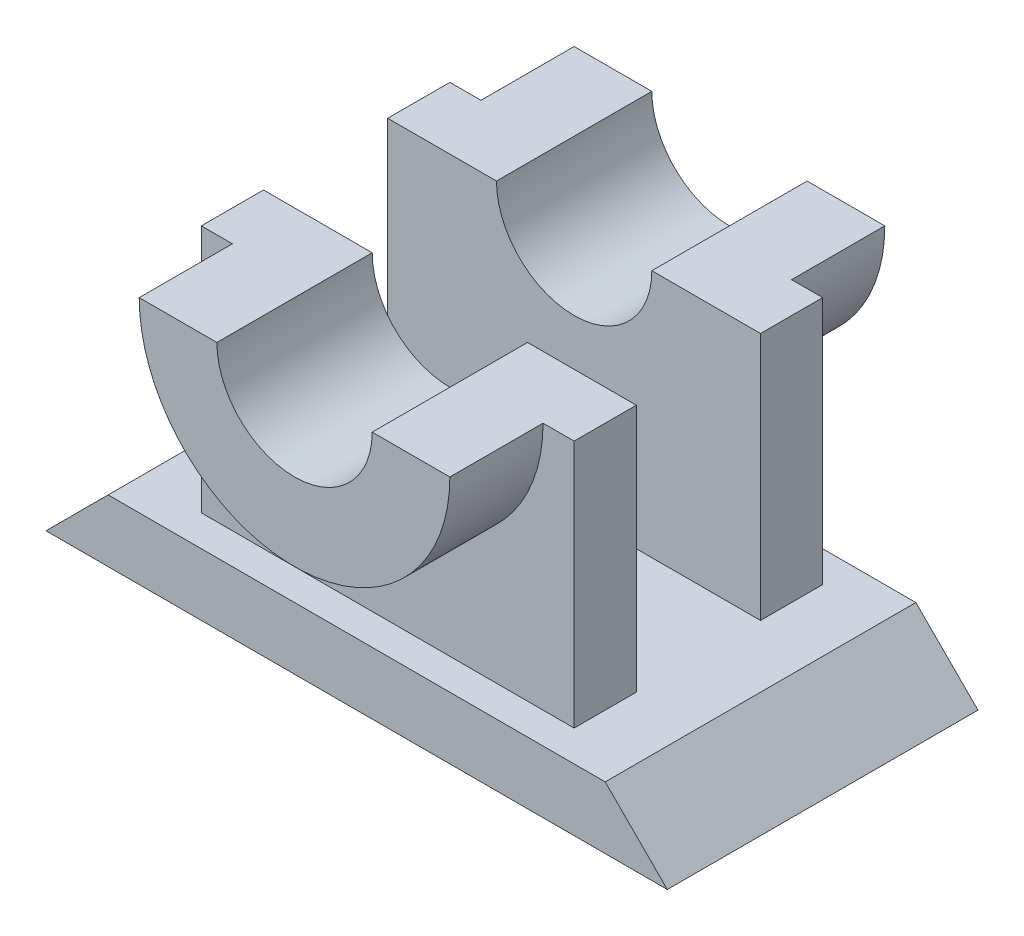
ISO-10303-21;
HEADER;
FILE_DESCRIPTION(('STEP AP214'),'2;1');
FILE_NAME('part.step','',(''),(''),'','','');
FILE_SCHEMA(('AUTOMOTIVE_DESIGN { 1 0 10303 214 1 1 1 1 }'));
ENDSEC;
DATA;
#1=APPLICATION_CONTEXT('core data for automotive mechanical design processes');
#2=APPLICATION_PROTOCOL_DEFINITION('international standard','automotive_design',2000,#1);
#3=PRODUCT_CONTEXT('',#1,'mechanical');
#4=PRODUCT('Part','Part','',(#3));
#5=PRODUCT_RELATED_PRODUCT_CATEGORY('part','',(#4));
#6=PRODUCT_DEFINITION_FORMATION('','',#4);
#7=PRODUCT_DEFINITION_CONTEXT('part definition',#1,'design');
#8=PRODUCT_DEFINITION('design','',#6,#7);
#9=PRODUCT_DEFINITION_SHAPE('','',#8);
#10=(LENGTH_UNIT() NAMED_UNIT(*) SI_UNIT(.MILLI.,.METRE.));
#11=(NAMED_UNIT(*) PLANE_ANGLE_UNIT() SI_UNIT($,.RADIAN.));
#12=(NAMED_UNIT(*) SI_UNIT($,.STERADIAN.) SOLID_ANGLE_UNIT());
#13=UNCERTAINTY_MEASURE_WITH_UNIT(LENGTH_MEASURE(1.E-05),#10,'distance_accuracy_value','');
#14=(GEOMETRIC_REPRESENTATION_CONTEXT(3) GLOBAL_UNCERTAINTY_ASSIGNED_CONTEXT((#13)) GLOBAL_UNIT_ASSIGNED_CONTEXT((#10,
#11,#12)) REPRESENTATION_CONTEXT('',''));
#15=CARTESIAN_POINT('',(0.,0.,0.));
#16=DIRECTION('',(0.,0.,1.));
#17=DIRECTION('',(1.,0.,0.));
#18=AXIS2_PLACEMENT_3D('',#15,#16,#17);
#19=CARTESIAN_POINT('',(0.,9.99999999999999,25.));
#20=DIRECTION('',(0.,-1.,0.));
#21=DIRECTION('',(1.,0.,0.));
#22=AXIS2_PLACEMENT_3D('',#19,#20,#21);
#23=PLANE('',#22);
#24=DIRECTION('',(-1.,0.,0.));
#25=VECTOR('',#24,1.);
#26=CARTESIAN_POINT('',(0.,9.99999999999999,-25.));
#27=LINE('',#26,#25);
#28=CARTESIAN_POINT('',(90.,9.99999999999999,-25.));
#29=VERTEX_POINT('',#28);
#30=CARTESIAN_POINT('',(10.,9.99999999999999,-25.));
#31=VERTEX_POINT('',#30);
#32=EDGE_CURVE('E308',#29,#31,#27,.T.);
#33=ORIENTED_EDGE('',*,*,#32,.T.);
#34=DIRECTION('',(0.,0.,-1.));
#35=VECTOR('',#34,1.);
#36=CARTESIAN_POINT('',(10.,9.99999999999999,25.));
#37=LINE('',#36,#35);
#38=CARTESIAN_POINT('',(10.,9.99999999999999,25.));
#39=VERTEX_POINT('',#38);
#40=EDGE_CURVE('E11',#39,#31,#37,.T.);
#41=ORIENTED_EDGE('',*,*,#40,.F.);
#42=DIRECTION('',(-1.,0.,0.));
#43=VECTOR('',#42,1.);
#44=CARTESIAN_POINT('',(0.,9.99999999999999,25.));
#45=LINE('',#44,#43);
#46=CARTESIAN_POINT('',(90.,9.99999999999999,25.));
#47=VERTEX_POINT('',#46);
#48=EDGE_CURVE('E309',#47,#39,#45,.T.);
#49=ORIENTED_EDGE('',*,*,#48,.F.);
#50=DIRECTION('',(0.,0.,-1.));
#51=VECTOR('',#50,1.);
#52=CARTESIAN_POINT('',(90.,9.99999999999999,25.));
#53=LINE('',#52,#51);
#54=EDGE_CURVE('E319',#47,#29,#53,.T.);
#55=ORIENTED_EDGE('',*,*,#54,.T.);
#56=EDGE_LOOP('',(#33,#41,#49,#55));
#57=FACE_BOUND('',#56,.T.);
#58=DIRECTION('',(0.,0.,-1.));
#59=VECTOR('',#58,1.);
#60=CARTESIAN_POINT('',(80.,10.,20.));
#61=LINE('',#60,#59);
#62=CARTESIAN_POINT('',(80.,10.,20.));
#63=VERTEX_POINT('',#62);
#64=CARTESIAN_POINT('',(80.,10.,10.));
#65=VERTEX_POINT('',#64);
#66=EDGE_CURVE('E301',#63,#65,#61,.T.);
#67=ORIENTED_EDGE('',*,*,#66,.F.);
#68=DIRECTION('',(-1.,0.,0.));
#69=VECTOR('',#68,1.);
#70=CARTESIAN_POINT('',(0.,9.99999999999999,20.));
#71=LINE('',#70,#69);
#72=CARTESIAN_POINT('',(20.,9.99999999999999,20.));
#73=VERTEX_POINT('',#72);
#74=EDGE_CURVE('E61',#63,#73,#71,.T.);
#75=ORIENTED_EDGE('',*,*,#74,.T.);
#76=DIRECTION('',(0.,0.,-1.));
#77=VECTOR('',#76,1.);
#78=CARTESIAN_POINT('',(20.,9.99999999999999,20.));
#79=LINE('',#78,#77);
#80=CARTESIAN_POINT('',(20.,9.99999999999999,10.));
#81=VERTEX_POINT('',#80);
#82=EDGE_CURVE('E304',#73,#81,#79,.T.);
#83=ORIENTED_EDGE('',*,*,#82,.T.);
#84=DIRECTION('',(-1.,0.,0.));
#85=VECTOR('',#84,1.);
#86=CARTESIAN_POINT('',(0.,9.99999999999999,10.));
#87=LINE('',#86,#85);
#88=EDGE_CURVE('E292',#65,#81,#87,.T.);
#89=ORIENTED_EDGE('',*,*,#88,.F.);
#90=EDGE_LOOP('',(#67,#75,#83,#89));
#91=FACE_BOUND('',#90,.T.);
#92=DIRECTION('',(-1.,0.,0.));
#93=VECTOR('',#92,1.);
#94=CARTESIAN_POINT('',(0.,9.99999999999999,-20.));
#95=LINE('',#94,#93);
#96=CARTESIAN_POINT('',(80.,10.,-20.));
#97=VERTEX_POINT('',#96);
#98=CARTESIAN_POINT('',(20.,9.99999999999999,-20.));
#99=VERTEX_POINT('',#98);
#100=EDGE_CURVE('E246',#97,#99,#95,.T.);
#101=ORIENTED_EDGE('',*,*,#100,.F.);
#102=DIRECTION('',(0.,0.,1.));
#103=VECTOR('',#102,1.);
#104=CARTESIAN_POINT('',(80.,10.,-20.));
#105=LINE('',#104,#103);
#106=CARTESIAN_POINT('',(80.,10.,-10.));
#107=VERTEX_POINT('',#106);
#108=EDGE_CURVE('E265',#97,#107,#105,.T.);
#109=ORIENTED_EDGE('',*,*,#108,.T.);
#110=DIRECTION('',(-1.,0.,0.));
#111=VECTOR('',#110,1.);
#112=CARTESIAN_POINT('',(0.,9.99999999999999,-10.));
#113=LINE('',#112,#111);
#114=CARTESIAN_POINT('',(20.,9.99999999999999,-10.));
#115=VERTEX_POINT('',#114);
#116=EDGE_CURVE('E255',#107,#115,#113,.T.);
#117=ORIENTED_EDGE('',*,*,#116,.T.);
#118=DIRECTION('',(0.,0.,1.));
#119=VECTOR('',#118,1.);
#120=CARTESIAN_POINT('',(20.,9.99999999999999,-20.));
#121=LINE('',#120,#119);
#122=EDGE_CURVE('E268',#99,#115,#121,.T.);
#123=ORIENTED_EDGE('',*,*,#122,.F.);
#124=EDGE_LOOP('',(#101,#109,#117,#123));
#125=FACE_BOUND('',#124,.T.);
#126=ADVANCED_FACE('F39',(#57,#91,#125),#23,.F.);
#127=CARTESIAN_POINT('',(0.,0.,25.));
#128=DIRECTION('',(0.707106781186547,-0.707106781186548,0.));
#129=DIRECTION('',(0.707106781186548,0.707106781186547,0.));
#130=AXIS2_PLACEMENT_3D('',#127,#128,#129);
#131=PLANE('',#130);
#132=DIRECTION('',(-0.707106781186548,-0.707106781186547,0.));
#133=VECTOR('',#132,1.);
#134=CARTESIAN_POINT('',(0.,0.,-25.));
#135=LINE('',#134,#133);
#136=CARTESIAN_POINT('',(0.,0.,-25.));
#137=VERTEX_POINT('',#136);
#138=EDGE_CURVE('E322',#31,#137,#135,.T.);
#139=ORIENTED_EDGE('',*,*,#138,.T.);
#140=DIRECTION('',(0.,0.,-1.));
#141=VECTOR('',#140,1.);
#142=CARTESIAN_POINT('',(0.,0.,25.));
#143=LINE('',#142,#141);
#144=CARTESIAN_POINT('',(0.,0.,25.));
#145=VERTEX_POINT('',#144);
#146=EDGE_CURVE('E46',#145,#137,#143,.T.);
#147=ORIENTED_EDGE('',*,*,#146,.F.);
#148=DIRECTION('',(-0.707106781186548,-0.707106781186547,0.));
#149=VECTOR('',#148,1.);
#150=CARTESIAN_POINT('',(0.,0.,25.));
#151=LINE('',#150,#149);
#152=EDGE_CURVE('E312',#39,#145,#151,.T.);
#153=ORIENTED_EDGE('',*,*,#152,.F.);
#154=ORIENTED_EDGE('',*,*,#40,.T.);
#155=EDGE_LOOP('',(#139,#147,#153,#154));
#156=FACE_BOUND('',#155,.T.);
#157=ADVANCED_FACE('F352',(#156),#131,.F.);
#158=CARTESIAN_POINT('',(0.,0.,25.));
#159=DIRECTION('',(0.,1.,0.));
#160=DIRECTION('',(0.,0.,1.));
#161=AXIS2_PLACEMENT_3D('',#158,#159,#160);
#162=PLANE('',#161);
#163=DIRECTION('',(1.,0.,0.));
#164=VECTOR('',#163,1.);
#165=CARTESIAN_POINT('',(0.,0.,-25.));
#166=LINE('',#165,#164);
#167=CARTESIAN_POINT('',(100.,0.,-25.));
#168=VERTEX_POINT('',#167);
#169=EDGE_CURVE('E324',#137,#168,#166,.T.);
#170=ORIENTED_EDGE('',*,*,#169,.T.);
#171=DIRECTION('',(0.,0.,-1.));
#172=VECTOR('',#171,1.);
#173=CARTESIAN_POINT('',(100.,0.,25.));
#174=LINE('',#173,#172);
#175=CARTESIAN_POINT('',(100.,0.,25.));
#176=VERTEX_POINT('',#175);
#177=EDGE_CURVE('E329',#176,#168,#174,.T.);
#178=ORIENTED_EDGE('',*,*,#177,.F.);
#179=DIRECTION('',(1.,0.,0.));
#180=VECTOR('',#179,1.);
#181=CARTESIAN_POINT('',(0.,0.,25.));
#182=LINE('',#181,#180);
#183=EDGE_CURVE('E315',#145,#176,#182,.T.);
#184=ORIENTED_EDGE('',*,*,#183,.F.);
#185=ORIENTED_EDGE('',*,*,#146,.T.);
#186=EDGE_LOOP('',(#170,#178,#184,#185));
#187=FACE_BOUND('',#186,.T.);
#188=ADVANCED_FACE('F336',(#187),#162,.F.);
#189=CARTESIAN_POINT('',(50.,50.,25.));
#190=DIRECTION('',(-0.707106781186548,-0.707106781186547,0.));
#191=DIRECTION('',(0.707106781186547,-0.707106781186548,0.));
#192=AXIS2_PLACEMENT_3D('',#189,#190,#191);
#193=PLANE('',#192);
#194=DIRECTION('',(-0.707106781186547,0.707106781186548,0.));
#195=VECTOR('',#194,1.);
#196=CARTESIAN_POINT('',(50.,50.,-25.));
#197=LINE('',#196,#195);
#198=EDGE_CURVE('E313',#168,#29,#197,.T.);
#199=ORIENTED_EDGE('',*,*,#198,.T.);
#200=ORIENTED_EDGE('',*,*,#54,.F.);
#201=DIRECTION('',(-0.707106781186547,0.707106781186548,0.));
#202=VECTOR('',#201,1.);
#203=CARTESIAN_POINT('',(50.,50.,25.));
#204=LINE('',#203,#202);
#205=EDGE_CURVE('E317',#176,#47,#204,.T.);
#206=ORIENTED_EDGE('',*,*,#205,.F.);
#207=ORIENTED_EDGE('',*,*,#177,.T.);
#208=EDGE_LOOP('',(#199,#200,#206,#207));
#209=FACE_BOUND('',#208,.T.);
#210=ADVANCED_FACE('F345',(#209),#193,.F.);
#211=CARTESIAN_POINT('',(0.,0.,25.));
#212=DIRECTION('',(0.,0.,1.));
#213=DIRECTION('',(1.,0.,0.));
#214=AXIS2_PLACEMENT_3D('',#211,#212,#213);
#215=PLANE('',#214);
#216=ORIENTED_EDGE('',*,*,#48,.T.);
#217=ORIENTED_EDGE('',*,*,#152,.T.);
#218=ORIENTED_EDGE('',*,*,#183,.T.);
#219=ORIENTED_EDGE('',*,*,#205,.T.);
#220=EDGE_LOOP('',(#216,#217,#218,#219));
#221=FACE_BOUND('',#220,.T.);
#222=ADVANCED_FACE('F351',(#221),#215,.T.);
#223=CARTESIAN_POINT('',(0.,0.,-25.));
#224=DIRECTION('',(0.,0.,1.));
#225=DIRECTION('',(1.,0.,0.));
#226=AXIS2_PLACEMENT_3D('',#223,#224,#225);
#227=PLANE('',#226);
#228=ORIENTED_EDGE('',*,*,#32,.F.);
#229=ORIENTED_EDGE('',*,*,#198,.F.);
#230=ORIENTED_EDGE('',*,*,#169,.F.);
#231=ORIENTED_EDGE('',*,*,#138,.F.);
#232=EDGE_LOOP('',(#228,#229,#230,#231));
#233=FACE_BOUND('',#232,.T.);
#234=ADVANCED_FACE('F342',(#233),#227,.F.);
#235=CARTESIAN_POINT('',(0.,50.,20.));
#236=DIRECTION('',(0.,1.,0.));
#237=DIRECTION('',(0.,0.,1.));
#238=AXIS2_PLACEMENT_3D('',#235,#236,#237);
#239=PLANE('',#238);
#240=DIRECTION('',(1.,0.,0.));
#241=VECTOR('',#240,1.);
#242=CARTESIAN_POINT('',(0.,50.,10.));
#243=LINE('',#242,#241);
#244=CARTESIAN_POINT('',(20.,50.,10.));
#245=VERTEX_POINT('',#244);
#246=CARTESIAN_POINT('',(37.5,50.,10.));
#247=VERTEX_POINT('',#246);
#248=EDGE_CURVE('E264',#245,#247,#243,.T.);
#249=ORIENTED_EDGE('',*,*,#248,.F.);
#250=DIRECTION('',(0.,0.,-1.));
#251=VECTOR('',#250,1.);
#252=CARTESIAN_POINT('',(20.,50.,20.));
#253=LINE('',#252,#251);
#254=CARTESIAN_POINT('',(20.,50.,20.));
#255=VERTEX_POINT('',#254);
#256=EDGE_CURVE('E306',#255,#245,#253,.T.);
#257=ORIENTED_EDGE('',*,*,#256,.F.);
#258=DIRECTION('',(1.,0.,0.));
#259=VECTOR('',#258,1.);
#260=CARTESIAN_POINT('',(0.,50.,20.));
#261=LINE('',#260,#259);
#262=CARTESIAN_POINT('',(25.,50.,20.));
#263=VERTEX_POINT('',#262);
#264=EDGE_CURVE('E274',#255,#263,#261,.T.);
#265=ORIENTED_EDGE('',*,*,#264,.T.);
#266=DIRECTION('',(0.,0.,-1.));
#267=VECTOR('',#266,1.);
#268=CARTESIAN_POINT('',(25.,50.,35.));
#269=LINE('',#268,#267);
#270=CARTESIAN_POINT('',(25.,50.,35.));
#271=VERTEX_POINT('',#270);
#272=EDGE_CURVE('E189',#271,#263,#269,.T.);
#273=ORIENTED_EDGE('',*,*,#272,.F.);
#274=DIRECTION('',(-1.,0.,0.));
#275=VECTOR('',#274,1.);
#276=CARTESIAN_POINT('',(0.,50.,35.));
#277=LINE('',#276,#275);
#278=CARTESIAN_POINT('',(37.5,50.,35.));
#279=VERTEX_POINT('',#278);
#280=EDGE_CURVE('E192',#279,#271,#277,.T.);
#281=ORIENTED_EDGE('',*,*,#280,.F.);
#282=DIRECTION('',(0.,0.,-1.));
#283=VECTOR('',#282,1.);
#284=CARTESIAN_POINT('',(37.5,50.,35.));
#285=LINE('',#284,#283);
#286=EDGE_CURVE('E177',#279,#247,#285,.T.);
#287=ORIENTED_EDGE('',*,*,#286,.T.);
#288=EDGE_LOOP('',(#249,#257,#265,#273,#281,#287));
#289=FACE_BOUND('',#288,.T.);
#290=ADVANCED_FACE('F193',(#289),#239,.T.);
#291=CARTESIAN_POINT('',(20.,0.,20.));
#292=DIRECTION('',(-1.,0.,0.));
#293=DIRECTION('',(0.,0.,1.));
#294=AXIS2_PLACEMENT_3D('',#291,#292,#293);
#295=PLANE('',#294);
#296=DIRECTION('',(0.,1.,0.));
#297=VECTOR('',#296,1.);
#298=CARTESIAN_POINT('',(20.,0.,10.));
#299=LINE('',#298,#297);
#300=EDGE_CURVE('E289',#81,#245,#299,.T.);
#301=ORIENTED_EDGE('',*,*,#300,.F.);
#302=ORIENTED_EDGE('',*,*,#82,.F.);
#303=DIRECTION('',(0.,1.,0.));
#304=VECTOR('',#303,1.);
#305=CARTESIAN_POINT('',(20.,0.,20.));
#306=LINE('',#305,#304);
#307=EDGE_CURVE('E277',#73,#255,#306,.T.);
#308=ORIENTED_EDGE('',*,*,#307,.T.);
#309=ORIENTED_EDGE('',*,*,#256,.T.);
#310=EDGE_LOOP('',(#301,#302,#308,#309));
#311=FACE_BOUND('',#310,.T.);
#312=ADVANCED_FACE('F368',(#311),#295,.T.);
#313=CARTESIAN_POINT('',(80.,0.,20.));
#314=DIRECTION('',(1.,0.,0.));
#315=DIRECTION('',(0.,0.,-1.));
#316=AXIS2_PLACEMENT_3D('',#313,#314,#315);
#317=PLANE('',#316);
#318=DIRECTION('',(0.,-1.,0.));
#319=VECTOR('',#318,1.);
#320=CARTESIAN_POINT('',(80.,0.,10.));
#321=LINE('',#320,#319);
#322=CARTESIAN_POINT('',(80.,50.,10.));
#323=VERTEX_POINT('',#322);
#324=EDGE_CURVE('E295',#323,#65,#321,.T.);
#325=ORIENTED_EDGE('',*,*,#324,.F.);
#326=DIRECTION('',(0.,0.,-1.));
#327=VECTOR('',#326,1.);
#328=CARTESIAN_POINT('',(80.,50.,20.));
#329=LINE('',#328,#327);
#330=CARTESIAN_POINT('',(80.,50.,20.));
#331=VERTEX_POINT('',#330);
#332=EDGE_CURVE('E287',#331,#323,#329,.T.);
#333=ORIENTED_EDGE('',*,*,#332,.F.);
#334=DIRECTION('',(0.,-1.,0.));
#335=VECTOR('',#334,1.);
#336=CARTESIAN_POINT('',(80.,0.,20.));
#337=LINE('',#336,#335);
#338=EDGE_CURVE('E281',#331,#63,#337,.T.);
#339=ORIENTED_EDGE('',*,*,#338,.T.);
#340=ORIENTED_EDGE('',*,*,#66,.T.);
#341=EDGE_LOOP('',(#325,#333,#339,#340));
#342=FACE_BOUND('',#341,.T.);
#343=ADVANCED_FACE('F371',(#342),#317,.T.);
#344=CARTESIAN_POINT('',(0.,50.,20.));
#345=DIRECTION('',(0.,1.,0.));
#346=DIRECTION('',(0.,0.,1.));
#347=AXIS2_PLACEMENT_3D('',#344,#345,#346);
#348=PLANE('',#347);
#349=DIRECTION('',(1.,0.,0.));
#350=VECTOR('',#349,1.);
#351=CARTESIAN_POINT('',(0.,50.,10.));
#352=LINE('',#351,#350);
#353=CARTESIAN_POINT('',(62.5,50.,10.));
#354=VERTEX_POINT('',#353);
#355=EDGE_CURVE('E275',#354,#323,#352,.T.);
#356=ORIENTED_EDGE('',*,*,#355,.F.);
#357=DIRECTION('',(0.,0.,-1.));
#358=VECTOR('',#357,1.);
#359=CARTESIAN_POINT('',(62.5,50.,35.));
#360=LINE('',#359,#358);
#361=CARTESIAN_POINT('',(62.5,50.,35.));
#362=VERTEX_POINT('',#361);
#363=EDGE_CURVE('E206',#362,#354,#360,.T.);
#364=ORIENTED_EDGE('',*,*,#363,.F.);
#365=DIRECTION('',(1.,0.,0.));
#366=VECTOR('',#365,1.);
#367=CARTESIAN_POINT('',(0.,50.,35.));
#368=LINE('',#367,#366);
#369=CARTESIAN_POINT('',(75.,50.,35.));
#370=VERTEX_POINT('',#369);
#371=EDGE_CURVE('E201',#362,#370,#368,.T.);
#372=ORIENTED_EDGE('',*,*,#371,.T.);
#373=DIRECTION('',(0.,0.,-1.));
#374=VECTOR('',#373,1.);
#375=CARTESIAN_POINT('',(75.,50.,35.));
#376=LINE('',#375,#374);
#377=CARTESIAN_POINT('',(75.,50.,20.));
#378=VERTEX_POINT('',#377);
#379=EDGE_CURVE('E209',#370,#378,#376,.T.);
#380=ORIENTED_EDGE('',*,*,#379,.T.);
#381=DIRECTION('',(1.,0.,0.));
#382=VECTOR('',#381,1.);
#383=CARTESIAN_POINT('',(0.,50.,20.));
#384=LINE('',#383,#382);
#385=EDGE_CURVE('E284',#378,#331,#384,.T.);
#386=ORIENTED_EDGE('',*,*,#385,.T.);
#387=ORIENTED_EDGE('',*,*,#332,.T.);
#388=EDGE_LOOP('',(#356,#364,#372,#380,#386,#387));
#389=FACE_BOUND('',#388,.T.);
#390=ADVANCED_FACE('F375',(#389),#348,.T.);
#391=CARTESIAN_POINT('',(0.,0.,20.));
#392=DIRECTION('',(0.,0.,1.));
#393=DIRECTION('',(1.,0.,0.));
#394=AXIS2_PLACEMENT_3D('',#391,#392,#393);
#395=PLANE('',#394);
#396=CARTESIAN_POINT('',(50.,50.,20.));
#397=DIRECTION('',(0.,0.,1.));
#398=DIRECTION('',(1.,0.,0.));
#399=AXIS2_PLACEMENT_3D('',#396,#397,#398);
#400=CIRCLE('',#399,25.);
#401=EDGE_CURVE('E272',#263,#378,#400,.T.);
#402=ORIENTED_EDGE('',*,*,#401,.F.);
#403=ORIENTED_EDGE('',*,*,#264,.F.);
#404=ORIENTED_EDGE('',*,*,#307,.F.);
#405=ORIENTED_EDGE('',*,*,#74,.F.);
#406=ORIENTED_EDGE('',*,*,#338,.F.);
#407=ORIENTED_EDGE('',*,*,#385,.F.);
#408=EDGE_LOOP('',(#402,#403,#404,#405,#406,#407));
#409=FACE_BOUND('',#408,.T.);
#410=ADVANCED_FACE('F379',(#409),#395,.T.);
#411=CARTESIAN_POINT('',(0.,0.,10.));
#412=DIRECTION('',(0.,0.,1.));
#413=DIRECTION('',(1.,0.,0.));
#414=AXIS2_PLACEMENT_3D('',#411,#412,#413);
#415=PLANE('',#414);
#416=ORIENTED_EDGE('',*,*,#248,.T.);
#417=CARTESIAN_POINT('',(50.,50.,10.));
#418=DIRECTION('',(0.,0.,1.));
#419=DIRECTION('',(1.,0.,0.));
#420=AXIS2_PLACEMENT_3D('',#417,#418,#419);
#421=CIRCLE('',#420,12.5);
#422=EDGE_CURVE('E185',#247,#354,#421,.T.);
#423=ORIENTED_EDGE('',*,*,#422,.T.);
#424=ORIENTED_EDGE('',*,*,#355,.T.);
#425=ORIENTED_EDGE('',*,*,#324,.T.);
#426=ORIENTED_EDGE('',*,*,#88,.T.);
#427=ORIENTED_EDGE('',*,*,#300,.T.);
#428=EDGE_LOOP('',(#416,#423,#424,#425,#426,#427));
#429=FACE_BOUND('',#428,.T.);
#430=ADVANCED_FACE('F381',(#429),#415,.F.);
#431=CARTESIAN_POINT('',(0.,50.,-20.));
#432=DIRECTION('',(0.,-1.,0.));
#433=DIRECTION('',(0.,0.,-1.));
#434=AXIS2_PLACEMENT_3D('',#431,#432,#433);
#435=PLANE('',#434);
#436=DIRECTION('',(1.,0.,0.));
#437=VECTOR('',#436,1.);
#438=CARTESIAN_POINT('',(0.,50.,-10.));
#439=LINE('',#438,#437);
#440=CARTESIAN_POINT('',(62.5,50.,-10.));
#441=VERTEX_POINT('',#440);
#442=CARTESIAN_POINT('',(80.,50.,-10.));
#443=VERTEX_POINT('',#442);
#444=EDGE_CURVE('E242',#441,#443,#439,.T.);
#445=ORIENTED_EDGE('',*,*,#444,.T.);
#446=DIRECTION('',(0.,0.,1.));
#447=VECTOR('',#446,1.);
#448=CARTESIAN_POINT('',(80.,50.,-20.));
#449=LINE('',#448,#447);
#450=CARTESIAN_POINT('',(80.,50.,-20.));
#451=VERTEX_POINT('',#450);
#452=EDGE_CURVE('E261',#451,#443,#449,.T.);
#453=ORIENTED_EDGE('',*,*,#452,.F.);
#454=DIRECTION('',(1.,0.,0.));
#455=VECTOR('',#454,1.);
#456=CARTESIAN_POINT('',(0.,50.,-20.));
#457=LINE('',#456,#455);
#458=CARTESIAN_POINT('',(75.,50.,-20.));
#459=VERTEX_POINT('',#458);
#460=EDGE_CURVE('E250',#459,#451,#457,.T.);
#461=ORIENTED_EDGE('',*,*,#460,.F.);
#462=DIRECTION('',(0.,0.,1.));
#463=VECTOR('',#462,1.);
#464=CARTESIAN_POINT('',(75.,50.,-35.));
#465=LINE('',#464,#463);
#466=CARTESIAN_POINT('',(75.,50.,-35.));
#467=VERTEX_POINT('',#466);
#468=EDGE_CURVE('E223',#467,#459,#465,.T.);
#469=ORIENTED_EDGE('',*,*,#468,.F.);
#470=DIRECTION('',(1.,0.,0.));
#471=VECTOR('',#470,1.);
#472=CARTESIAN_POINT('',(0.,50.,-35.));
#473=LINE('',#472,#471);
#474=CARTESIAN_POINT('',(62.5,50.,-35.));
#475=VERTEX_POINT('',#474);
#476=EDGE_CURVE('E216',#475,#467,#473,.T.);
#477=ORIENTED_EDGE('',*,*,#476,.F.);
#478=DIRECTION('',(0.,0.,1.));
#479=VECTOR('',#478,1.);
#480=CARTESIAN_POINT('',(62.5,50.,-35.));
#481=LINE('',#480,#479);
#482=EDGE_CURVE('E233',#475,#441,#481,.T.);
#483=ORIENTED_EDGE('',*,*,#482,.T.);
#484=EDGE_LOOP('',(#445,#453,#461,#469,#477,#483));
#485=FACE_BOUND('',#484,.T.);
#486=ADVANCED_FACE('F384',(#485),#435,.F.);
#487=CARTESIAN_POINT('',(80.,0.,-20.));
#488=DIRECTION('',(-1.,0.,0.));
#489=DIRECTION('',(0.,0.,1.));
#490=AXIS2_PLACEMENT_3D('',#487,#488,#489);
#491=PLANE('',#490);
#492=DIRECTION('',(0.,-1.,0.));
#493=VECTOR('',#492,1.);
#494=CARTESIAN_POINT('',(80.,0.,-10.));
#495=LINE('',#494,#493);
#496=EDGE_CURVE('E258',#443,#107,#495,.T.);
#497=ORIENTED_EDGE('',*,*,#496,.T.);
#498=ORIENTED_EDGE('',*,*,#108,.F.);
#499=DIRECTION('',(0.,-1.,0.));
#500=VECTOR('',#499,1.);
#501=CARTESIAN_POINT('',(80.,0.,-20.));
#502=LINE('',#501,#500);
#503=EDGE_CURVE('E248',#451,#97,#502,.T.);
#504=ORIENTED_EDGE('',*,*,#503,.F.);
#505=ORIENTED_EDGE('',*,*,#452,.T.);
#506=EDGE_LOOP('',(#497,#498,#504,#505));
#507=FACE_BOUND('',#506,.T.);
#508=ADVANCED_FACE('F397',(#507),#491,.F.);
#509=CARTESIAN_POINT('',(20.,0.,-20.));
#510=DIRECTION('',(1.,0.,0.));
#511=DIRECTION('',(0.,0.,-1.));
#512=AXIS2_PLACEMENT_3D('',#509,#510,#511);
#513=PLANE('',#512);
#514=DIRECTION('',(0.,1.,0.));
#515=VECTOR('',#514,1.);
#516=CARTESIAN_POINT('',(20.,0.,-10.));
#517=LINE('',#516,#515);
#518=CARTESIAN_POINT('',(20.,50.,-10.));
#519=VERTEX_POINT('',#518);
#520=EDGE_CURVE('E53',#115,#519,#517,.T.);
#521=ORIENTED_EDGE('',*,*,#520,.T.);
#522=DIRECTION('',(0.,0.,1.));
#523=VECTOR('',#522,1.);
#524=CARTESIAN_POINT('',(20.,50.,-20.));
#525=LINE('',#524,#523);
#526=CARTESIAN_POINT('',(20.,50.,-20.));
#527=VERTEX_POINT('',#526);
#528=EDGE_CURVE('E252',#527,#519,#525,.T.);
#529=ORIENTED_EDGE('',*,*,#528,.F.);
#530=DIRECTION('',(0.,1.,0.));
#531=VECTOR('',#530,1.);
#532=CARTESIAN_POINT('',(20.,0.,-20.));
#533=LINE('',#532,#531);
#534=EDGE_CURVE('E244',#99,#527,#533,.T.);
#535=ORIENTED_EDGE('',*,*,#534,.F.);
#536=ORIENTED_EDGE('',*,*,#122,.T.);
#537=EDGE_LOOP('',(#521,#529,#535,#536));
#538=FACE_BOUND('',#537,.T.);
#539=ADVANCED_FACE('F393',(#538),#513,.F.);
#540=CARTESIAN_POINT('',(0.,50.,-20.));
#541=DIRECTION('',(0.,-1.,0.));
#542=DIRECTION('',(0.,0.,-1.));
#543=AXIS2_PLACEMENT_3D('',#540,#541,#542);
#544=PLANE('',#543);
#545=DIRECTION('',(1.,0.,0.));
#546=VECTOR('',#545,1.);
#547=CARTESIAN_POINT('',(0.,50.,-10.));
#548=LINE('',#547,#546);
#549=CARTESIAN_POINT('',(37.5,50.,-10.));
#550=VERTEX_POINT('',#549);
#551=EDGE_CURVE('E229',#519,#550,#548,.T.);
#552=ORIENTED_EDGE('',*,*,#551,.T.);
#553=DIRECTION('',(0.,0.,1.));
#554=VECTOR('',#553,1.);
#555=CARTESIAN_POINT('',(37.5,50.,-35.));
#556=LINE('',#555,#554);
#557=CARTESIAN_POINT('',(37.5,50.,-35.));
#558=VERTEX_POINT('',#557);
#559=EDGE_CURVE('E230',#558,#550,#556,.T.);
#560=ORIENTED_EDGE('',*,*,#559,.F.);
#561=DIRECTION('',(-1.,0.,0.));
#562=VECTOR('',#561,1.);
#563=CARTESIAN_POINT('',(0.,50.,-35.));
#564=LINE('',#563,#562);
#565=CARTESIAN_POINT('',(25.,50.,-35.));
#566=VERTEX_POINT('',#565);
#567=EDGE_CURVE('E220',#558,#566,#564,.T.);
#568=ORIENTED_EDGE('',*,*,#567,.T.);
#569=DIRECTION('',(0.,0.,1.));
#570=VECTOR('',#569,1.);
#571=CARTESIAN_POINT('',(25.,50.,-35.));
#572=LINE('',#571,#570);
#573=CARTESIAN_POINT('',(25.,50.,-20.));
#574=VERTEX_POINT('',#573);
#575=EDGE_CURVE('E226',#566,#574,#572,.T.);
#576=ORIENTED_EDGE('',*,*,#575,.T.);
#577=DIRECTION('',(1.,0.,0.));
#578=VECTOR('',#577,1.);
#579=CARTESIAN_POINT('',(0.,50.,-20.));
#580=LINE('',#579,#578);
#581=EDGE_CURVE('E241',#527,#574,#580,.T.);
#582=ORIENTED_EDGE('',*,*,#581,.F.);
#583=ORIENTED_EDGE('',*,*,#528,.T.);
#584=EDGE_LOOP('',(#552,#560,#568,#576,#582,#583));
#585=FACE_BOUND('',#584,.T.);
#586=ADVANCED_FACE('F389',(#585),#544,.F.);
#587=CARTESIAN_POINT('',(0.,0.,-20.));
#588=DIRECTION('',(0.,0.,1.));
#589=DIRECTION('',(1.,0.,0.));
#590=AXIS2_PLACEMENT_3D('',#587,#588,#589);
#591=PLANE('',#590);
#592=CARTESIAN_POINT('',(50.,50.,-20.));
#593=DIRECTION('',(0.,0.,1.));
#594=DIRECTION('',(1.,0.,0.));
#595=AXIS2_PLACEMENT_3D('',#592,#593,#594);
#596=CIRCLE('',#595,25.);
#597=EDGE_CURVE('E238',#574,#459,#596,.T.);
#598=ORIENTED_EDGE('',*,*,#597,.T.);
#599=ORIENTED_EDGE('',*,*,#460,.T.);
#600=ORIENTED_EDGE('',*,*,#503,.T.);
#601=ORIENTED_EDGE('',*,*,#100,.T.);
#602=ORIENTED_EDGE('',*,*,#534,.T.);
#603=ORIENTED_EDGE('',*,*,#581,.T.);
#604=EDGE_LOOP('',(#598,#599,#600,#601,#602,#603));
#605=FACE_BOUND('',#604,.T.);
#606=ADVANCED_FACE('F392',(#605),#591,.F.);
#607=CARTESIAN_POINT('',(0.,0.,-10.));
#608=DIRECTION('',(0.,0.,1.));
#609=DIRECTION('',(1.,0.,0.));
#610=AXIS2_PLACEMENT_3D('',#607,#608,#609);
#611=PLANE('',#610);
#612=ORIENTED_EDGE('',*,*,#444,.F.);
#613=CARTESIAN_POINT('',(50.,50.,-10.));
#614=DIRECTION('',(0.,0.,1.));
#615=DIRECTION('',(1.,0.,0.));
#616=AXIS2_PLACEMENT_3D('',#613,#614,#615);
#617=CIRCLE('',#616,12.5);
#618=EDGE_CURVE('E188',#550,#441,#617,.T.);
#619=ORIENTED_EDGE('',*,*,#618,.F.);
#620=ORIENTED_EDGE('',*,*,#551,.F.);
#621=ORIENTED_EDGE('',*,*,#520,.F.);
#622=ORIENTED_EDGE('',*,*,#116,.F.);
#623=ORIENTED_EDGE('',*,*,#496,.F.);
#624=EDGE_LOOP('',(#612,#619,#620,#621,#622,#623));
#625=FACE_BOUND('',#624,.T.);
#626=ADVANCED_FACE('F405',(#625),#611,.T.);
#627=CARTESIAN_POINT('',(50.,50.,-35.));
#628=DIRECTION('',(0.,0.,1.));
#629=DIRECTION('',(1.,0.,0.));
#630=AXIS2_PLACEMENT_3D('',#627,#628,#629);
#631=CYLINDRICAL_SURFACE('',#630,25.);
#632=ORIENTED_EDGE('',*,*,#597,.F.);
#633=ORIENTED_EDGE('',*,*,#575,.F.);
#634=CARTESIAN_POINT('',(50.,50.,-35.));
#635=DIRECTION('',(0.,0.,1.));
#636=DIRECTION('',(1.,0.,0.));
#637=AXIS2_PLACEMENT_3D('',#634,#635,#636);
#638=CIRCLE('',#637,25.);
#639=EDGE_CURVE('E213',#566,#467,#638,.T.);
#640=ORIENTED_EDGE('',*,*,#639,.T.);
#641=ORIENTED_EDGE('',*,*,#468,.T.);
#642=EDGE_LOOP('',(#632,#633,#640,#641));
#643=FACE_BOUND('',#642,.T.);
#644=ADVANCED_FACE('F408',(#643),#631,.T.);
#645=CARTESIAN_POINT('',(50.,50.,-35.));
#646=DIRECTION('',(0.,0.,1.));
#647=DIRECTION('',(1.,0.,0.));
#648=AXIS2_PLACEMENT_3D('',#645,#646,#647);
#649=CYLINDRICAL_SURFACE('',#648,12.5);
#650=ORIENTED_EDGE('',*,*,#618,.T.);
#651=ORIENTED_EDGE('',*,*,#482,.F.);
#652=CARTESIAN_POINT('',(50.,50.,-35.));
#653=DIRECTION('',(0.,0.,1.));
#654=DIRECTION('',(1.,0.,0.));
#655=AXIS2_PLACEMENT_3D('',#652,#653,#654);
#656=CIRCLE('',#655,12.5);
#657=EDGE_CURVE('E218',#558,#475,#656,.T.);
#658=ORIENTED_EDGE('',*,*,#657,.F.);
#659=ORIENTED_EDGE('',*,*,#559,.T.);
#660=EDGE_LOOP('',(#650,#651,#658,#659));
#661=FACE_BOUND('',#660,.T.);
#662=ADVANCED_FACE('F414',(#661),#649,.F.);
#663=CARTESIAN_POINT('',(0.,0.,-35.));
#664=DIRECTION('',(0.,0.,1.));
#665=DIRECTION('',(1.,0.,0.));
#666=AXIS2_PLACEMENT_3D('',#663,#664,#665);
#667=PLANE('',#666);
#668=ORIENTED_EDGE('',*,*,#639,.F.);
#669=ORIENTED_EDGE('',*,*,#567,.F.);
#670=ORIENTED_EDGE('',*,*,#657,.T.);
#671=ORIENTED_EDGE('',*,*,#476,.T.);
#672=EDGE_LOOP('',(#668,#669,#670,#671));
#673=FACE_BOUND('',#672,.T.);
#674=ADVANCED_FACE('F418',(#673),#667,.F.);
#675=CARTESIAN_POINT('',(50.,50.,35.));
#676=DIRECTION('',(0.,0.,-1.));
#677=DIRECTION('',(-1.,0.,0.));
#678=AXIS2_PLACEMENT_3D('',#675,#676,#677);
#679=CYLINDRICAL_SURFACE('',#678,12.5);
#680=ORIENTED_EDGE('',*,*,#422,.F.);
#681=ORIENTED_EDGE('',*,*,#286,.F.);
#682=CARTESIAN_POINT('',(50.,50.,35.));
#683=DIRECTION('',(0.,0.,1.));
#684=DIRECTION('',(1.,0.,0.));
#685=AXIS2_PLACEMENT_3D('',#682,#683,#684);
#686=CIRCLE('',#685,12.5);
#687=EDGE_CURVE('E182',#279,#362,#686,.T.);
#688=ORIENTED_EDGE('',*,*,#687,.T.);
#689=ORIENTED_EDGE('',*,*,#363,.T.);
#690=EDGE_LOOP('',(#680,#681,#688,#689));
#691=FACE_BOUND('',#690,.T.);
#692=ADVANCED_FACE('F179',(#691),#679,.F.);
#693=CARTESIAN_POINT('',(50.,50.,35.));
#694=DIRECTION('',(0.,0.,-1.));
#695=DIRECTION('',(-1.,0.,0.));
#696=AXIS2_PLACEMENT_3D('',#693,#694,#695);
#697=CYLINDRICAL_SURFACE('',#696,25.);
#698=ORIENTED_EDGE('',*,*,#401,.T.);
#699=ORIENTED_EDGE('',*,*,#379,.F.);
#700=CARTESIAN_POINT('',(50.,50.,35.));
#701=DIRECTION('',(0.,0.,1.));
#702=DIRECTION('',(1.,0.,0.));
#703=AXIS2_PLACEMENT_3D('',#700,#701,#702);
#704=CIRCLE('',#703,25.);
#705=EDGE_CURVE('E197',#271,#370,#704,.T.);
#706=ORIENTED_EDGE('',*,*,#705,.F.);
#707=ORIENTED_EDGE('',*,*,#272,.T.);
#708=EDGE_LOOP('',(#698,#699,#706,#707));
#709=FACE_BOUND('',#708,.T.);
#710=ADVANCED_FACE('F425',(#709),#697,.T.);
#711=CARTESIAN_POINT('',(0.,0.,35.));
#712=DIRECTION('',(0.,0.,1.));
#713=DIRECTION('',(1.,0.,0.));
#714=AXIS2_PLACEMENT_3D('',#711,#712,#713);
#715=PLANE('',#714);
#716=ORIENTED_EDGE('',*,*,#687,.F.);
#717=ORIENTED_EDGE('',*,*,#280,.T.);
#718=ORIENTED_EDGE('',*,*,#705,.T.);
#719=ORIENTED_EDGE('',*,*,#371,.F.);
#720=EDGE_LOOP('',(#716,#717,#718,#719));
#721=FACE_BOUND('',#720,.T.);
#722=ADVANCED_FACE('F199',(#721),#715,.T.);
#723=CLOSED_SHELL('',(#126,#157,#188,#210,#222,#234,#290,#312,#343,#390,#410,#430,#486,#508,
#539,#586,#606,#626,#644,#662,#674,#692,#710,#722));
#724=MANIFOLD_SOLID_BREP('B2',#723);
#725=ADVANCED_BREP_SHAPE_REPRESENTATION('',(#18,#724),#14);
#726=SHAPE_DEFINITION_REPRESENTATION(#9,#725);
ENDSEC;
END-ISO-10303-21;
